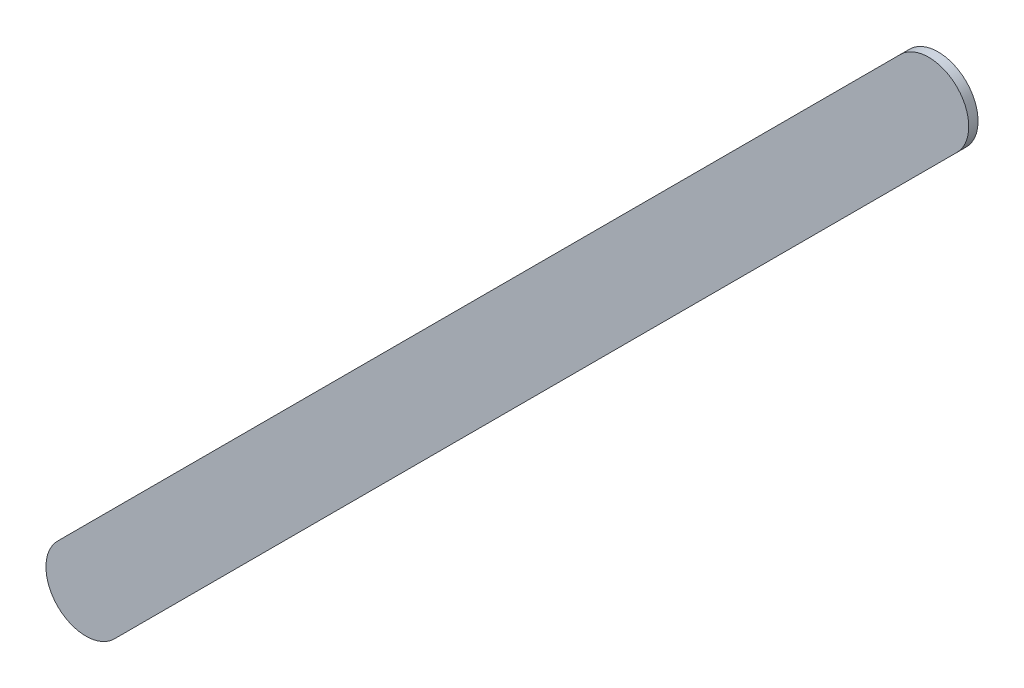
ISO-10303-21;
HEADER;
FILE_DESCRIPTION(('STEP AP214'),'2;1');
FILE_NAME('part.step','',(''),(''),'','','');
FILE_SCHEMA(('AUTOMOTIVE_DESIGN { 1 0 10303 214 1 1 1 1 }'));
ENDSEC;
DATA;
#1=APPLICATION_CONTEXT('core data for automotive mechanical design processes');
#2=APPLICATION_PROTOCOL_DEFINITION('international standard','automotive_design',2000,#1);
#3=PRODUCT_CONTEXT('',#1,'mechanical');
#4=PRODUCT('Part','Part','',(#3));
#5=PRODUCT_RELATED_PRODUCT_CATEGORY('part','',(#4));
#6=PRODUCT_DEFINITION_FORMATION('','',#4);
#7=PRODUCT_DEFINITION_CONTEXT('part definition',#1,'design');
#8=PRODUCT_DEFINITION('design','',#6,#7);
#9=PRODUCT_DEFINITION_SHAPE('','',#8);
#10=(LENGTH_UNIT() NAMED_UNIT(*) SI_UNIT(.MILLI.,.METRE.));
#11=(NAMED_UNIT(*) PLANE_ANGLE_UNIT() SI_UNIT($,.RADIAN.));
#12=(NAMED_UNIT(*) SI_UNIT($,.STERADIAN.) SOLID_ANGLE_UNIT());
#13=UNCERTAINTY_MEASURE_WITH_UNIT(LENGTH_MEASURE(1.E-05),#10,'distance_accuracy_value','');
#14=(GEOMETRIC_REPRESENTATION_CONTEXT(3) GLOBAL_UNCERTAINTY_ASSIGNED_CONTEXT((#13)) GLOBAL_UNIT_ASSIGNED_CONTEXT((#10,
#11,#12)) REPRESENTATION_CONTEXT('',''));
#15=CARTESIAN_POINT('',(0.,0.,0.));
#16=DIRECTION('',(0.,0.,1.));
#17=DIRECTION('',(1.,0.,0.));
#18=AXIS2_PLACEMENT_3D('',#15,#16,#17);
#19=CARTESIAN_POINT('',(135.166066,-66.606066,1.635));
#20=DIRECTION('',(0.,0.,1.));
#21=DIRECTION('',(1.,0.,0.));
#22=AXIS2_PLACEMENT_3D('',#19,#20,#21);
#23=PLANE('',#22);
#24=DIRECTION('',(0.707106781186548,0.707106781186548,0.));
#25=VECTOR('',#24,1.);
#26=CARTESIAN_POINT('',(135.166066,-66.606066,1.635));
#27=LINE('',#26,#25);
#28=CARTESIAN_POINT('',(135.166066,-66.606066,1.635));
#29=VERTEX_POINT('',#28);
#30=CARTESIAN_POINT('',(138.326066,-63.446066,1.635));
#31=VERTEX_POINT('',#30);
#32=EDGE_CURVE('E81',#29,#31,#27,.T.);
#33=ORIENTED_EDGE('',*,*,#32,.T.);
#34=CARTESIAN_POINT('',(138.2199995,-63.3399995,1.635));
#35=DIRECTION('',(0.,0.,1.));
#36=DIRECTION('',(0.707106781186548,-0.707106781186548,0.));
#37=AXIS2_PLACEMENT_3D('',#34,#35,#36);
#38=CIRCLE('',#37,0.150000682813);
#39=CARTESIAN_POINT('',(138.113933,-63.233933,1.635));
#40=VERTEX_POINT('',#39);
#41=EDGE_CURVE('E102',#31,#40,#38,.T.);
#42=ORIENTED_EDGE('',*,*,#41,.T.);
#43=DIRECTION('',(-0.707106781186548,-0.707106781186548,0.));
#44=VECTOR('',#43,1.);
#45=CARTESIAN_POINT('',(138.113933,-63.233933,1.635));
#46=LINE('',#45,#44);
#47=CARTESIAN_POINT('',(134.953933,-66.393933,1.635));
#48=VERTEX_POINT('',#47);
#49=EDGE_CURVE('E74',#40,#48,#46,.T.);
#50=ORIENTED_EDGE('',*,*,#49,.T.);
#51=CARTESIAN_POINT('',(135.0599995,-66.4999995,1.635));
#52=DIRECTION('',(0.,0.,1.));
#53=DIRECTION('',(-0.707106781186548,0.707106781186548,0.));
#54=AXIS2_PLACEMENT_3D('',#51,#52,#53);
#55=CIRCLE('',#54,0.150000682813);
#56=EDGE_CURVE('E11',#48,#29,#55,.T.);
#57=ORIENTED_EDGE('',*,*,#56,.T.);
#58=EDGE_LOOP('',(#33,#42,#50,#57));
#59=FACE_BOUND('',#58,.T.);
#60=ADVANCED_FACE('F17',(#59),#23,.T.);
#61=CARTESIAN_POINT('',(135.166066,-66.606066,1.6));
#62=DIRECTION('',(0.,0.,1.));
#63=DIRECTION('',(1.,0.,0.));
#64=AXIS2_PLACEMENT_3D('',#61,#62,#63);
#65=PLANE('',#64);
#66=CARTESIAN_POINT('',(135.0599995,-66.4999995,1.6));
#67=DIRECTION('',(0.,0.,1.));
#68=DIRECTION('',(-0.707106781186548,0.707106781186548,0.));
#69=AXIS2_PLACEMENT_3D('',#66,#67,#68);
#70=CIRCLE('',#69,0.150000682813);
#71=CARTESIAN_POINT('',(134.953933,-66.393933,1.6));
#72=VERTEX_POINT('',#71);
#73=CARTESIAN_POINT('',(135.166066,-66.606066,1.6));
#74=VERTEX_POINT('',#73);
#75=EDGE_CURVE('E25',#72,#74,#70,.T.);
#76=ORIENTED_EDGE('',*,*,#75,.F.);
#77=DIRECTION('',(-0.707106781186548,-0.707106781186548,0.));
#78=VECTOR('',#77,1.);
#79=CARTESIAN_POINT('',(138.113933,-63.233933,1.6));
#80=LINE('',#79,#78);
#81=CARTESIAN_POINT('',(138.113933,-63.233933,1.6));
#82=VERTEX_POINT('',#81);
#83=EDGE_CURVE('E99',#82,#72,#80,.T.);
#84=ORIENTED_EDGE('',*,*,#83,.F.);
#85=CARTESIAN_POINT('',(138.2199995,-63.3399995,1.6));
#86=DIRECTION('',(0.,0.,1.));
#87=DIRECTION('',(0.707106781186548,-0.707106781186548,0.));
#88=AXIS2_PLACEMENT_3D('',#85,#86,#87);
#89=CIRCLE('',#88,0.150000682813);
#90=CARTESIAN_POINT('',(138.326066,-63.446066,1.6));
#91=VERTEX_POINT('',#90);
#92=EDGE_CURVE('E83',#91,#82,#89,.T.);
#93=ORIENTED_EDGE('',*,*,#92,.F.);
#94=DIRECTION('',(0.707106781186548,0.707106781186548,0.));
#95=VECTOR('',#94,1.);
#96=CARTESIAN_POINT('',(135.166066,-66.606066,1.6));
#97=LINE('',#96,#95);
#98=EDGE_CURVE('E79',#74,#91,#97,.T.);
#99=ORIENTED_EDGE('',*,*,#98,.F.);
#100=EDGE_LOOP('',(#76,#84,#93,#99));
#101=FACE_BOUND('',#100,.T.);
#102=ADVANCED_FACE('F85',(#101),#65,.F.);
#103=CARTESIAN_POINT('',(135.0599995,-66.4999995,1.6));
#104=DIRECTION('',(0.,0.,-1.));
#105=DIRECTION('',(-0.707106781186548,0.707106781186548,0.));
#106=AXIS2_PLACEMENT_3D('',#103,#104,#105);
#107=CYLINDRICAL_SURFACE('',#106,0.150000682813);
#108=ORIENTED_EDGE('',*,*,#75,.T.);
#109=DIRECTION('',(0.,0.,1.));
#110=VECTOR('',#109,1.);
#111=CARTESIAN_POINT('',(135.166066,-66.606066,1.6));
#112=LINE('',#111,#110);
#113=EDGE_CURVE('E68',#74,#29,#112,.T.);
#114=ORIENTED_EDGE('',*,*,#113,.T.);
#115=ORIENTED_EDGE('',*,*,#56,.F.);
#116=DIRECTION('',(0.,0.,1.));
#117=VECTOR('',#116,1.);
#118=CARTESIAN_POINT('',(134.953933,-66.393933,1.6));
#119=LINE('',#118,#117);
#120=EDGE_CURVE('E71',#72,#48,#119,.T.);
#121=ORIENTED_EDGE('',*,*,#120,.F.);
#122=EDGE_LOOP('',(#108,#114,#115,#121));
#123=FACE_BOUND('',#122,.T.);
#124=ADVANCED_FACE('F67',(#123),#107,.T.);
#125=CARTESIAN_POINT('',(138.113933,-63.233933,1.6));
#126=DIRECTION('',(0.707106781186548,-0.707106781186548,0.));
#127=DIRECTION('',(0.,0.,-1.));
#128=AXIS2_PLACEMENT_3D('',#125,#126,#127);
#129=PLANE('',#128);
#130=ORIENTED_EDGE('',*,*,#83,.T.);
#131=ORIENTED_EDGE('',*,*,#120,.T.);
#132=ORIENTED_EDGE('',*,*,#49,.F.);
#133=DIRECTION('',(0.,0.,1.));
#134=VECTOR('',#133,1.);
#135=CARTESIAN_POINT('',(138.113933,-63.233933,1.6));
#136=LINE('',#135,#134);
#137=EDGE_CURVE('E109',#82,#40,#136,.T.);
#138=ORIENTED_EDGE('',*,*,#137,.F.);
#139=EDGE_LOOP('',(#130,#131,#132,#138));
#140=FACE_BOUND('',#139,.T.);
#141=ADVANCED_FACE('F122',(#140),#129,.F.);
#142=CARTESIAN_POINT('',(138.2199995,-63.3399995,1.6));
#143=DIRECTION('',(0.,0.,-1.));
#144=DIRECTION('',(0.707106781186548,-0.707106781186548,0.));
#145=AXIS2_PLACEMENT_3D('',#142,#143,#144);
#146=CYLINDRICAL_SURFACE('',#145,0.150000682813);
#147=ORIENTED_EDGE('',*,*,#92,.T.);
#148=ORIENTED_EDGE('',*,*,#137,.T.);
#149=ORIENTED_EDGE('',*,*,#41,.F.);
#150=DIRECTION('',(0.,0.,1.));
#151=VECTOR('',#150,1.);
#152=CARTESIAN_POINT('',(138.326066,-63.446066,1.6));
#153=LINE('',#152,#151);
#154=EDGE_CURVE('E89',#91,#31,#153,.T.);
#155=ORIENTED_EDGE('',*,*,#154,.F.);
#156=EDGE_LOOP('',(#147,#148,#149,#155));
#157=FACE_BOUND('',#156,.T.);
#158=ADVANCED_FACE('F120',(#157),#146,.T.);
#159=CARTESIAN_POINT('',(135.166066,-66.606066,1.6));
#160=DIRECTION('',(-0.707106781186548,0.707106781186548,0.));
#161=DIRECTION('',(0.,0.,1.));
#162=AXIS2_PLACEMENT_3D('',#159,#160,#161);
#163=PLANE('',#162);
#164=ORIENTED_EDGE('',*,*,#98,.T.);
#165=ORIENTED_EDGE('',*,*,#154,.T.);
#166=ORIENTED_EDGE('',*,*,#32,.F.);
#167=ORIENTED_EDGE('',*,*,#113,.F.);
#168=EDGE_LOOP('',(#164,#165,#166,#167));
#169=FACE_BOUND('',#168,.T.);
#170=ADVANCED_FACE('F77',(#169),#163,.F.);
#171=CLOSED_SHELL('',(#60,#102,#124,#141,#158,#170));
#172=MANIFOLD_SOLID_BREP('B1',#171);
#173=ADVANCED_BREP_SHAPE_REPRESENTATION('',(#18,#172),#14);
#174=SHAPE_DEFINITION_REPRESENTATION(#9,#173);
ENDSEC;
END-ISO-10303-21;
